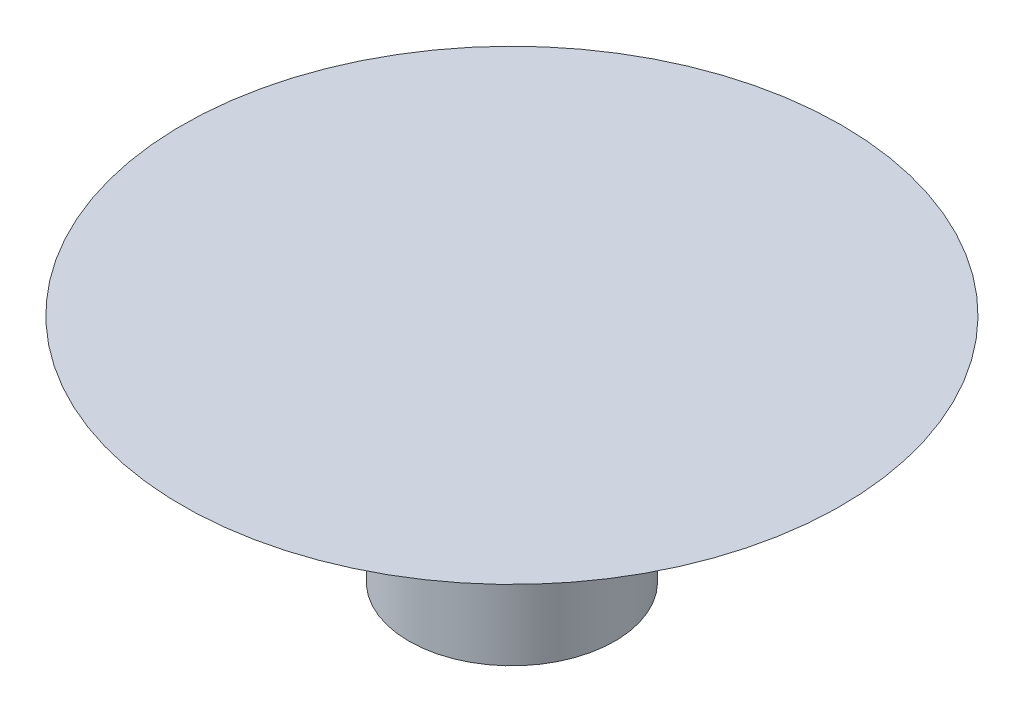
ISO-10303-21;
HEADER;
FILE_DESCRIPTION(('STEP AP214'),'2;1');
FILE_NAME('part.step','',(''),(''),'','','');
FILE_SCHEMA(('AUTOMOTIVE_DESIGN { 1 0 10303 214 1 1 1 1 }'));
ENDSEC;
DATA;
#1=APPLICATION_CONTEXT('core data for automotive mechanical design processes');
#2=APPLICATION_PROTOCOL_DEFINITION('international standard','automotive_design',2000,#1);
#3=PRODUCT_CONTEXT('',#1,'mechanical');
#4=PRODUCT('Part','Part','',(#3));
#5=PRODUCT_RELATED_PRODUCT_CATEGORY('part','',(#4));
#6=PRODUCT_DEFINITION_FORMATION('','',#4);
#7=PRODUCT_DEFINITION_CONTEXT('part definition',#1,'design');
#8=PRODUCT_DEFINITION('design','',#6,#7);
#9=PRODUCT_DEFINITION_SHAPE('','',#8);
#10=(LENGTH_UNIT() NAMED_UNIT(*) SI_UNIT(.MILLI.,.METRE.));
#11=(NAMED_UNIT(*) PLANE_ANGLE_UNIT() SI_UNIT($,.RADIAN.));
#12=(NAMED_UNIT(*) SI_UNIT($,.STERADIAN.) SOLID_ANGLE_UNIT());
#13=UNCERTAINTY_MEASURE_WITH_UNIT(LENGTH_MEASURE(1.E-05),#10,'distance_accuracy_value','');
#14=(GEOMETRIC_REPRESENTATION_CONTEXT(3) GLOBAL_UNCERTAINTY_ASSIGNED_CONTEXT((#13)) GLOBAL_UNIT_ASSIGNED_CONTEXT((#10,
#11,#12)) REPRESENTATION_CONTEXT('',''));
#15=CARTESIAN_POINT('',(0.,0.,0.));
#16=DIRECTION('',(0.,0.,1.));
#17=DIRECTION('',(1.,0.,0.));
#18=AXIS2_PLACEMENT_3D('',#15,#16,#17);
#19=CARTESIAN_POINT('',(0.,-1.8,0.));
#20=DIRECTION('',(0.,1.,0.));
#21=DIRECTION('',(0.,0.,1.));
#22=AXIS2_PLACEMENT_3D('',#19,#20,#21);
#23=CYLINDRICAL_SURFACE('',#22,1.25);
#24=CARTESIAN_POINT('',(0.,-1.8,0.));
#25=DIRECTION('',(0.,1.,0.));
#26=DIRECTION('',(0.,0.,1.));
#27=AXIS2_PLACEMENT_3D('',#24,#25,#26);
#28=CIRCLE('',#27,1.25);
#29=CARTESIAN_POINT('',(0.,-1.8,1.25));
#30=VERTEX_POINT('',#29);
#31=EDGE_CURVE('E11',#30,#30,#28,.T.);
#32=ORIENTED_EDGE('',*,*,#31,.T.);
#33=EDGE_LOOP('',(#32));
#34=FACE_BOUND('',#33,.T.);
#35=CARTESIAN_POINT('',(0.,0.,0.));
#36=DIRECTION('',(0.,1.,0.));
#37=DIRECTION('',(0.,0.,1.));
#38=AXIS2_PLACEMENT_3D('',#35,#36,#37);
#39=CIRCLE('',#38,1.25);
#40=CARTESIAN_POINT('',(0.,0.,1.25));
#41=VERTEX_POINT('',#40);
#42=EDGE_CURVE('E41',#41,#41,#39,.T.);
#43=ORIENTED_EDGE('',*,*,#42,.F.);
#44=EDGE_LOOP('',(#43));
#45=FACE_BOUND('',#44,.T.);
#46=ADVANCED_FACE('F38',(#34,#45),#23,.T.);
#47=CARTESIAN_POINT('',(0.,-1.8,0.));
#48=DIRECTION('',(0.,1.,0.));
#49=DIRECTION('',(0.,0.,1.));
#50=AXIS2_PLACEMENT_3D('',#47,#48,#49);
#51=PLANE('',#50);
#52=ORIENTED_EDGE('',*,*,#31,.F.);
#53=EDGE_LOOP('',(#52));
#54=FACE_BOUND('',#53,.T.);
#55=ADVANCED_FACE('F74',(#54),#51,.F.);
#56=CARTESIAN_POINT('',(1.25,0.,0.));
#57=DIRECTION('',(0.,-1.,0.));
#58=DIRECTION('',(0.,0.,-1.));
#59=AXIS2_PLACEMENT_3D('',#56,#57,#58);
#60=PLANE('',#59);
#61=ORIENTED_EDGE('',*,*,#42,.T.);
#62=EDGE_LOOP('',(#61));
#63=FACE_BOUND('',#62,.T.);
#64=CARTESIAN_POINT('',(0.,0.,0.));
#65=DIRECTION('',(0.,-1.,0.));
#66=DIRECTION('',(0.,0.,-1.));
#67=AXIS2_PLACEMENT_3D('',#64,#65,#66);
#68=CIRCLE('',#67,2.04176198925072);
#69=CARTESIAN_POINT('',(0.,0.,-2.04176198925072));
#70=VERTEX_POINT('',#69);
#71=EDGE_CURVE('E48',#70,#70,#68,.T.);
#72=ORIENTED_EDGE('',*,*,#71,.T.);
#73=EDGE_LOOP('',(#72));
#74=FACE_BOUND('',#73,.T.);
#75=ADVANCED_FACE('F78',(#63,#74),#60,.T.);
#76=CARTESIAN_POINT('',(0.,0.8,0.));
#77=DIRECTION('',(0.,-1.,0.));
#78=DIRECTION('',(0.,0.,-1.));
#79=AXIS2_PLACEMENT_3D('',#76,#77,#78);
#80=TOROIDAL_SURFACE('',#79,2.04176198925072,0.8);
#81=CARTESIAN_POINT('',(0.,0.28576991225077,0.));
#82=DIRECTION('',(0.,-1.,0.));
#83=DIRECTION('',(0.,0.,-1.));
#84=AXIS2_PLACEMENT_3D('',#81,#82,#83);
#85=CIRCLE('',#84,2.65459754374591);
#86=CARTESIAN_POINT('',(0.,0.28576991225077,-2.65459754374591));
#87=VERTEX_POINT('',#86);
#88=EDGE_CURVE('E52',#87,#87,#85,.T.);
#89=ORIENTED_EDGE('',*,*,#88,.T.);
#90=EDGE_LOOP('',(#89));
#91=FACE_BOUND('',#90,.T.);
#92=ORIENTED_EDGE('',*,*,#71,.F.);
#93=EDGE_LOOP('',(#92));
#94=FACE_BOUND('',#93,.T.);
#95=ADVANCED_FACE('F85',(#91,#94),#80,.T.);
#96=CARTESIAN_POINT('',(0.,0.28576991225077,0.));
#97=DIRECTION('',(0.,1.,0.));
#98=DIRECTION('',(0.,0.,1.));
#99=AXIS2_PLACEMENT_3D('',#96,#97,#98);
#100=CONICAL_SURFACE('',#99,2.65459754374591,0.698131700797731);
#101=CARTESIAN_POINT('',(0.,0.42846017549846,0.));
#102=DIRECTION('',(0.,-1.,0.));
#103=DIRECTION('',(0.,0.,-1.));
#104=AXIS2_PLACEMENT_3D('',#101,#102,#103);
#105=CIRCLE('',#104,2.77432889100963);
#106=CARTESIAN_POINT('',(0.,0.42846017549846,-2.77432889100963));
#107=VERTEX_POINT('',#106);
#108=EDGE_CURVE('E55',#107,#107,#105,.T.);
#109=ORIENTED_EDGE('',*,*,#108,.T.);
#110=EDGE_LOOP('',(#109));
#111=FACE_BOUND('',#110,.T.);
#112=ORIENTED_EDGE('',*,*,#88,.F.);
#113=EDGE_LOOP('',(#112));
#114=FACE_BOUND('',#113,.T.);
#115=ADVANCED_FACE('F71',(#111,#114),#100,.T.);
#116=CARTESIAN_POINT('',(0.,-0.6,0.));
#117=DIRECTION('',(0.,-1.,0.));
#118=DIRECTION('',(0.,0.,-1.));
#119=AXIS2_PLACEMENT_3D('',#116,#117,#118);
#120=TOROIDAL_SURFACE('',#119,4.,1.6);
#121=CARTESIAN_POINT('',(0.,1.,0.));
#122=DIRECTION('',(0.,-1.,0.));
#123=DIRECTION('',(0.,0.,-1.));
#124=AXIS2_PLACEMENT_3D('',#121,#122,#123);
#125=CIRCLE('',#124,4.);
#126=CARTESIAN_POINT('',(0.,1.,-4.));
#127=VERTEX_POINT('',#126);
#128=EDGE_CURVE('E58',#127,#127,#125,.T.);
#129=ORIENTED_EDGE('',*,*,#128,.T.);
#130=EDGE_LOOP('',(#129));
#131=FACE_BOUND('',#130,.T.);
#132=ORIENTED_EDGE('',*,*,#108,.F.);
#133=EDGE_LOOP('',(#132));
#134=FACE_BOUND('',#133,.T.);
#135=ADVANCED_FACE('F62',(#131,#134),#120,.F.);
#136=CARTESIAN_POINT('',(0.,1.,0.));
#137=DIRECTION('',(0.,1.,0.));
#138=DIRECTION('',(0.,0.,1.));
#139=AXIS2_PLACEMENT_3D('',#136,#137,#138);
#140=PLANE('',#139);
#141=ORIENTED_EDGE('',*,*,#128,.F.);
#142=EDGE_LOOP('',(#141));
#143=FACE_BOUND('',#142,.T.);
#144=ADVANCED_FACE('F65',(#143),#140,.T.);
#145=CLOSED_SHELL('',(#46,#55,#75,#95,#115,#135,#144));
#146=MANIFOLD_SOLID_BREP('B2',#145);
#147=ADVANCED_BREP_SHAPE_REPRESENTATION('',(#18,#146),#14);
#148=SHAPE_DEFINITION_REPRESENTATION(#9,#147);
ENDSEC;
END-ISO-10303-21;
